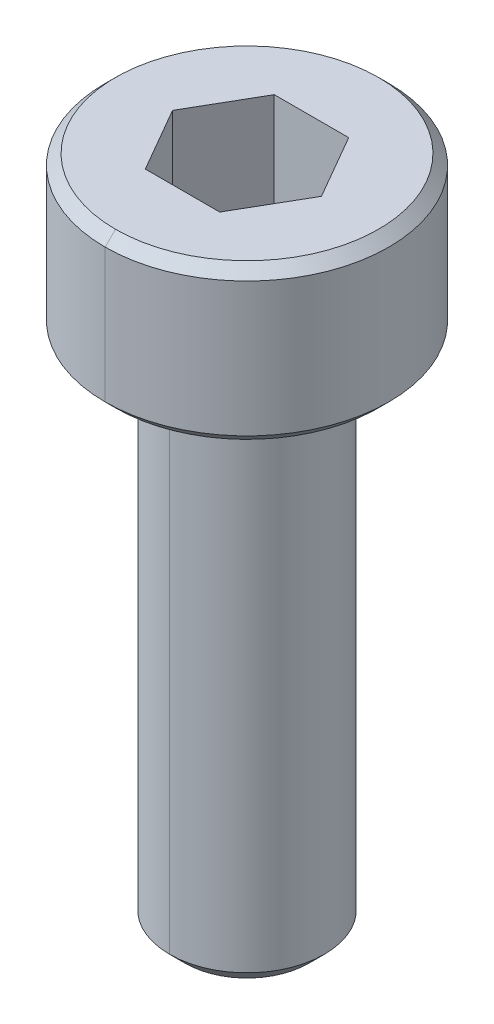
ISO-10303-21;
HEADER;
FILE_DESCRIPTION(('STEP AP214'),'2;1');
FILE_NAME('part.step','',(''),(''),'','','');
FILE_SCHEMA(('AUTOMOTIVE_DESIGN { 1 0 10303 214 1 1 1 1 }'));
ENDSEC;
DATA;
#1=APPLICATION_CONTEXT('core data for automotive mechanical design processes');
#2=APPLICATION_PROTOCOL_DEFINITION('international standard','automotive_design',2000,#1);
#3=PRODUCT_CONTEXT('',#1,'mechanical');
#4=PRODUCT('Part','Part','',(#3));
#5=PRODUCT_RELATED_PRODUCT_CATEGORY('part','',(#4));
#6=PRODUCT_DEFINITION_FORMATION('','',#4);
#7=PRODUCT_DEFINITION_CONTEXT('part definition',#1,'design');
#8=PRODUCT_DEFINITION('design','',#6,#7);
#9=PRODUCT_DEFINITION_SHAPE('','',#8);
#10=(LENGTH_UNIT() NAMED_UNIT(*) SI_UNIT(.MILLI.,.METRE.));
#11=(NAMED_UNIT(*) PLANE_ANGLE_UNIT() SI_UNIT($,.RADIAN.));
#12=(NAMED_UNIT(*) SI_UNIT($,.STERADIAN.) SOLID_ANGLE_UNIT());
#13=UNCERTAINTY_MEASURE_WITH_UNIT(LENGTH_MEASURE(1.E-05),#10,'distance_accuracy_value','');
#14=(GEOMETRIC_REPRESENTATION_CONTEXT(3) GLOBAL_UNCERTAINTY_ASSIGNED_CONTEXT((#13)) GLOBAL_UNIT_ASSIGNED_CONTEXT((#10,
#11,#12)) REPRESENTATION_CONTEXT('',''));
#15=CARTESIAN_POINT('',(0.,0.,0.));
#16=DIRECTION('',(0.,0.,1.));
#17=DIRECTION('',(1.,0.,0.));
#18=AXIS2_PLACEMENT_3D('',#15,#16,#17);
#19=CARTESIAN_POINT('',(0.721687836487033,11.,1.25));
#20=DIRECTION('',(0.866025403784439,0.,0.5));
#21=DIRECTION('',(0.5,0.,-0.866025403784439));
#22=AXIS2_PLACEMENT_3D('',#19,#20,#21);
#23=PLANE('',#22);
#24=DIRECTION('',(0.5,0.,-0.866025403784439));
#25=VECTOR('',#24,1.);
#26=CARTESIAN_POINT('',(0.721687836487033,11.,1.25));
#27=LINE('',#26,#25);
#28=CARTESIAN_POINT('',(0.721687836487033,11.,1.25));
#29=VERTEX_POINT('',#28);
#30=CARTESIAN_POINT('',(1.44337567297406,11.,0.));
#31=VERTEX_POINT('',#30);
#32=EDGE_CURVE('E179',#29,#31,#27,.T.);
#33=ORIENTED_EDGE('',*,*,#32,.F.);
#34=DIRECTION('',(0.,1.,0.));
#35=VECTOR('',#34,1.);
#36=CARTESIAN_POINT('',(0.721687836487033,11.,1.25));
#37=LINE('',#36,#35);
#38=CARTESIAN_POINT('',(0.721687836487033,13.,1.25));
#39=VERTEX_POINT('',#38);
#40=EDGE_CURVE('E167',#29,#39,#37,.T.);
#41=ORIENTED_EDGE('',*,*,#40,.T.);
#42=DIRECTION('',(0.5,0.,-0.866025403784439));
#43=VECTOR('',#42,1.);
#44=CARTESIAN_POINT('',(0.721687836487033,13.,1.25));
#45=LINE('',#44,#43);
#46=CARTESIAN_POINT('',(1.44337567297406,13.,0.));
#47=VERTEX_POINT('',#46);
#48=EDGE_CURVE('E181',#47,#39,#45,.F.);
#49=ORIENTED_EDGE('',*,*,#48,.F.);
#50=DIRECTION('',(0.,1.,0.));
#51=VECTOR('',#50,1.);
#52=CARTESIAN_POINT('',(1.44337567297406,11.,0.));
#53=LINE('',#52,#51);
#54=EDGE_CURVE('E174',#47,#31,#53,.F.);
#55=ORIENTED_EDGE('',*,*,#54,.T.);
#56=EDGE_LOOP('',(#33,#41,#49,#55));
#57=FACE_BOUND('',#56,.T.);
#58=ADVANCED_FACE('F17',(#57),#23,.F.);
#59=CARTESIAN_POINT('',(1.44337567297406,11.,0.));
#60=DIRECTION('',(0.866025403784438,0.,-0.5));
#61=DIRECTION('',(-0.5,0.,-0.866025403784438));
#62=AXIS2_PLACEMENT_3D('',#59,#60,#61);
#63=PLANE('',#62);
#64=DIRECTION('',(-0.5,0.,-0.866025403784438));
#65=VECTOR('',#64,1.);
#66=CARTESIAN_POINT('',(1.44337567297406,11.,0.));
#67=LINE('',#66,#65);
#68=CARTESIAN_POINT('',(0.721687836487031,11.,-1.25));
#69=VERTEX_POINT('',#68);
#70=EDGE_CURVE('E172',#31,#69,#67,.T.);
#71=ORIENTED_EDGE('',*,*,#70,.F.);
#72=ORIENTED_EDGE('',*,*,#54,.F.);
#73=DIRECTION('',(-0.5,0.,-0.866025403784438));
#74=VECTOR('',#73,1.);
#75=CARTESIAN_POINT('',(1.44337567297406,13.,0.));
#76=LINE('',#75,#74);
#77=CARTESIAN_POINT('',(0.721687836487032,13.,-1.25));
#78=VERTEX_POINT('',#77);
#79=EDGE_CURVE('E177',#78,#47,#76,.F.);
#80=ORIENTED_EDGE('',*,*,#79,.F.);
#81=DIRECTION('',(0.,1.,0.));
#82=VECTOR('',#81,1.);
#83=CARTESIAN_POINT('',(0.721687836487031,11.,-1.25));
#84=LINE('',#83,#82);
#85=EDGE_CURVE('E162',#78,#69,#84,.F.);
#86=ORIENTED_EDGE('',*,*,#85,.T.);
#87=EDGE_LOOP('',(#71,#72,#80,#86));
#88=FACE_BOUND('',#87,.T.);
#89=ADVANCED_FACE('F417',(#88),#63,.F.);
#90=CARTESIAN_POINT('',(-0.721687836487032,11.,1.25));
#91=DIRECTION('',(0.,0.,1.));
#92=DIRECTION('',(1.,0.,0.));
#93=AXIS2_PLACEMENT_3D('',#90,#91,#92);
#94=PLANE('',#93);
#95=DIRECTION('',(1.,0.,0.));
#96=VECTOR('',#95,1.);
#97=CARTESIAN_POINT('',(1.44337567297406,11.,1.25));
#98=LINE('',#97,#96);
#99=CARTESIAN_POINT('',(-0.721687836487032,11.,1.25));
#100=VERTEX_POINT('',#99);
#101=EDGE_CURVE('E159',#100,#29,#98,.T.);
#102=ORIENTED_EDGE('',*,*,#101,.F.);
#103=DIRECTION('',(0.,1.,0.));
#104=VECTOR('',#103,1.);
#105=CARTESIAN_POINT('',(-0.721687836487032,11.,1.25));
#106=LINE('',#105,#104);
#107=CARTESIAN_POINT('',(-0.721687836487032,13.,1.25));
#108=VERTEX_POINT('',#107);
#109=EDGE_CURVE('E148',#100,#108,#106,.T.);
#110=ORIENTED_EDGE('',*,*,#109,.T.);
#111=DIRECTION('',(1.,0.,0.));
#112=VECTOR('',#111,1.);
#113=CARTESIAN_POINT('',(-0.721687836487032,13.,1.25));
#114=LINE('',#113,#112);
#115=EDGE_CURVE('E170',#39,#108,#114,.F.);
#116=ORIENTED_EDGE('',*,*,#115,.F.);
#117=ORIENTED_EDGE('',*,*,#40,.F.);
#118=EDGE_LOOP('',(#102,#110,#116,#117));
#119=FACE_BOUND('',#118,.T.);
#120=ADVANCED_FACE('F408',(#119),#94,.F.);
#121=CARTESIAN_POINT('',(0.721687836487031,11.,-1.25));
#122=DIRECTION('',(0.,0.,-1.));
#123=DIRECTION('',(-1.,0.,0.));
#124=AXIS2_PLACEMENT_3D('',#121,#122,#123);
#125=PLANE('',#124);
#126=DIRECTION('',(1.,0.,0.));
#127=VECTOR('',#126,1.);
#128=CARTESIAN_POINT('',(1.44337567297406,11.,-1.25));
#129=LINE('',#128,#127);
#130=CARTESIAN_POINT('',(-0.721687836487032,11.,-1.25));
#131=VERTEX_POINT('',#130);
#132=EDGE_CURVE('E156',#69,#131,#129,.F.);
#133=ORIENTED_EDGE('',*,*,#132,.F.);
#134=ORIENTED_EDGE('',*,*,#85,.F.);
#135=DIRECTION('',(-1.,0.,0.));
#136=VECTOR('',#135,1.);
#137=CARTESIAN_POINT('',(0.721687836487031,13.,-1.25));
#138=LINE('',#137,#136);
#139=CARTESIAN_POINT('',(-0.721687836487032,13.,-1.25));
#140=VERTEX_POINT('',#139);
#141=EDGE_CURVE('E165',#140,#78,#138,.F.);
#142=ORIENTED_EDGE('',*,*,#141,.F.);
#143=DIRECTION('',(0.,1.,0.));
#144=VECTOR('',#143,1.);
#145=CARTESIAN_POINT('',(-0.721687836487032,11.,-1.25));
#146=LINE('',#145,#144);
#147=EDGE_CURVE('E146',#140,#131,#146,.F.);
#148=ORIENTED_EDGE('',*,*,#147,.T.);
#149=EDGE_LOOP('',(#133,#134,#142,#148));
#150=FACE_BOUND('',#149,.T.);
#151=ADVANCED_FACE('F399',(#150),#125,.F.);
#152=CARTESIAN_POINT('',(1.44337567297406,11.,0.));
#153=DIRECTION('',(0.,1.,0.));
#154=DIRECTION('',(0.,0.,1.));
#155=AXIS2_PLACEMENT_3D('',#152,#153,#154);
#156=PLANE('',#155);
#157=ORIENTED_EDGE('',*,*,#132,.T.);
#158=DIRECTION('',(-0.5,0.,0.866025403784439));
#159=VECTOR('',#158,1.);
#160=CARTESIAN_POINT('',(-0.721687836487032,11.,-1.25));
#161=LINE('',#160,#159);
#162=CARTESIAN_POINT('',(-1.44337567297406,11.,0.));
#163=VERTEX_POINT('',#162);
#164=EDGE_CURVE('E144',#131,#163,#161,.T.);
#165=ORIENTED_EDGE('',*,*,#164,.T.);
#166=DIRECTION('',(0.5,0.,0.866025403784438));
#167=VECTOR('',#166,1.);
#168=CARTESIAN_POINT('',(-1.44337567297406,11.,0.));
#169=LINE('',#168,#167);
#170=EDGE_CURVE('E151',#163,#100,#169,.T.);
#171=ORIENTED_EDGE('',*,*,#170,.T.);
#172=ORIENTED_EDGE('',*,*,#101,.T.);
#173=ORIENTED_EDGE('',*,*,#32,.T.);
#174=ORIENTED_EDGE('',*,*,#70,.T.);
#175=EDGE_LOOP('',(#157,#165,#171,#172,#173,#174));
#176=FACE_BOUND('',#175,.T.);
#177=ADVANCED_FACE('F390',(#176),#156,.T.);
#178=CARTESIAN_POINT('',(-1.44337567297406,11.,0.));
#179=DIRECTION('',(-0.866025403784438,0.,0.5));
#180=DIRECTION('',(0.5,0.,0.866025403784438));
#181=AXIS2_PLACEMENT_3D('',#178,#179,#180);
#182=PLANE('',#181);
#183=ORIENTED_EDGE('',*,*,#170,.F.);
#184=DIRECTION('',(0.,1.,0.));
#185=VECTOR('',#184,1.);
#186=CARTESIAN_POINT('',(-1.44337567297407,11.,0.));
#187=LINE('',#186,#185);
#188=CARTESIAN_POINT('',(-1.44337567297406,13.,0.));
#189=VERTEX_POINT('',#188);
#190=EDGE_CURVE('E141',#163,#189,#187,.T.);
#191=ORIENTED_EDGE('',*,*,#190,.T.);
#192=DIRECTION('',(0.5,0.,0.866025403784438));
#193=VECTOR('',#192,1.);
#194=CARTESIAN_POINT('',(-1.44337567297406,13.,0.));
#195=LINE('',#194,#193);
#196=EDGE_CURVE('E154',#108,#189,#195,.F.);
#197=ORIENTED_EDGE('',*,*,#196,.F.);
#198=ORIENTED_EDGE('',*,*,#109,.F.);
#199=EDGE_LOOP('',(#183,#191,#197,#198));
#200=FACE_BOUND('',#199,.T.);
#201=ADVANCED_FACE('F381',(#200),#182,.F.);
#202=CARTESIAN_POINT('',(-0.721687836487032,11.,-1.25));
#203=DIRECTION('',(-0.866025403784439,0.,-0.5));
#204=DIRECTION('',(-0.5,0.,0.866025403784439));
#205=AXIS2_PLACEMENT_3D('',#202,#203,#204);
#206=PLANE('',#205);
#207=ORIENTED_EDGE('',*,*,#164,.F.);
#208=ORIENTED_EDGE('',*,*,#147,.F.);
#209=DIRECTION('',(0.5,0.,-0.866025403784438));
#210=VECTOR('',#209,1.);
#211=CARTESIAN_POINT('',(-1.44337567297406,13.,0.));
#212=LINE('',#211,#210);
#213=EDGE_CURVE('E122',#189,#140,#212,.T.);
#214=ORIENTED_EDGE('',*,*,#213,.F.);
#215=ORIENTED_EDGE('',*,*,#190,.F.);
#216=EDGE_LOOP('',(#207,#208,#214,#215));
#217=FACE_BOUND('',#216,.T.);
#218=ADVANCED_FACE('F373',(#217),#206,.F.);
#219=CARTESIAN_POINT('',(0.,13.,-2.75));
#220=DIRECTION('',(0.,1.,0.));
#221=DIRECTION('',(0.,0.,1.));
#222=AXIS2_PLACEMENT_3D('',#219,#220,#221);
#223=PLANE('',#222);
#224=CARTESIAN_POINT('',(0.,13.0000000000337,0.));
#225=DIRECTION('',(0.,-1.,0.));
#226=DIRECTION('',(0.,0.,-1.));
#227=AXIS2_PLACEMENT_3D('',#224,#225,#226);
#228=CIRCLE('',#227,2.54999999992833);
#229=CARTESIAN_POINT('',(0.,13.0000000000337,-2.54999999992833));
#230=VERTEX_POINT('',#229);
#231=CARTESIAN_POINT('',(0.,13.0000000000337,2.54999999992833));
#232=VERTEX_POINT('',#231);
#233=EDGE_CURVE('E111',#230,#232,#228,.T.);
#234=ORIENTED_EDGE('',*,*,#233,.F.);
#235=CARTESIAN_POINT('',(0.,13.0000000000337,0.));
#236=DIRECTION('',(0.,-1.,0.));
#237=DIRECTION('',(0.,0.,-1.));
#238=AXIS2_PLACEMENT_3D('',#235,#236,#237);
#239=CIRCLE('',#238,2.54999999992833);
#240=EDGE_CURVE('E20',#232,#230,#239,.T.);
#241=ORIENTED_EDGE('',*,*,#240,.F.);
#242=EDGE_LOOP('',(#234,#241));
#243=FACE_BOUND('',#242,.T.);
#244=ORIENTED_EDGE('',*,*,#196,.T.);
#245=ORIENTED_EDGE('',*,*,#213,.T.);
#246=ORIENTED_EDGE('',*,*,#141,.T.);
#247=ORIENTED_EDGE('',*,*,#79,.T.);
#248=ORIENTED_EDGE('',*,*,#48,.T.);
#249=ORIENTED_EDGE('',*,*,#115,.T.);
#250=EDGE_LOOP('',(#244,#245,#246,#247,#248,#249));
#251=FACE_BOUND('',#250,.T.);
#252=ADVANCED_FACE('F112',(#243,#251),#223,.T.);
#253=CARTESIAN_POINT('',(0.,12.8000000000839,0.));
#254=DIRECTION('',(0.,-1.,0.));
#255=DIRECTION('',(0.,0.,-1.));
#256=AXIS2_PLACEMENT_3D('',#253,#254,#255);
#257=CONICAL_SURFACE('',#256,2.74999999987813,0.785398163397448);
#258=DIRECTION('',(0.,0.707106781186548,0.707106781186548));
#259=VECTOR('',#258,1.);
#260=CARTESIAN_POINT('',(0.,-498984.45,-499000.));
#261=LINE('',#260,#259);
#262=CARTESIAN_POINT('',(0.,12.800000000021,-2.74999999996953));
#263=VERTEX_POINT('',#262);
#264=EDGE_CURVE('E120',#263,#230,#261,.T.);
#265=ORIENTED_EDGE('',*,*,#264,.F.);
#266=CARTESIAN_POINT('',(0.,12.8,0.));
#267=DIRECTION('',(0.,-1.,0.));
#268=DIRECTION('',(0.,0.,-1.));
#269=AXIS2_PLACEMENT_3D('',#266,#267,#268);
#270=CIRCLE('',#269,2.75);
#271=CARTESIAN_POINT('',(0.,12.800000000021,2.74999999996953));
#272=VERTEX_POINT('',#271);
#273=EDGE_CURVE('E127',#272,#263,#270,.T.);
#274=ORIENTED_EDGE('',*,*,#273,.F.);
#275=DIRECTION('',(0.,0.707106781186548,-0.707106781186548));
#276=VECTOR('',#275,1.);
#277=CARTESIAN_POINT('',(6.11098752774529E-11,-498984.45,499000.));
#278=LINE('',#277,#276);
#279=EDGE_CURVE('E117',#232,#272,#278,.F.);
#280=ORIENTED_EDGE('',*,*,#279,.F.);
#281=ORIENTED_EDGE('',*,*,#240,.T.);
#282=EDGE_LOOP('',(#265,#274,#280,#281));
#283=FACE_BOUND('',#282,.T.);
#284=ADVANCED_FACE('F119',(#283),#257,.T.);
#285=CARTESIAN_POINT('',(0.,12.8000000000839,0.));
#286=DIRECTION('',(0.,-1.,0.));
#287=DIRECTION('',(0.,0.,-1.));
#288=AXIS2_PLACEMENT_3D('',#285,#286,#287);
#289=CONICAL_SURFACE('',#288,2.74999999987813,0.785398163397448);
#290=CARTESIAN_POINT('',(0.,12.8,0.));
#291=DIRECTION('',(0.,-1.,0.));
#292=DIRECTION('',(0.,0.,-1.));
#293=AXIS2_PLACEMENT_3D('',#290,#291,#292);
#294=CIRCLE('',#293,2.75);
#295=EDGE_CURVE('E125',#263,#272,#294,.T.);
#296=ORIENTED_EDGE('',*,*,#295,.F.);
#297=ORIENTED_EDGE('',*,*,#264,.T.);
#298=ORIENTED_EDGE('',*,*,#233,.T.);
#299=ORIENTED_EDGE('',*,*,#279,.T.);
#300=EDGE_LOOP('',(#296,#297,#298,#299));
#301=FACE_BOUND('',#300,.T.);
#302=ADVANCED_FACE('F123',(#301),#289,.T.);
#303=CARTESIAN_POINT('',(0.,0.,0.));
#304=DIRECTION('',(0.,-1.,0.));
#305=DIRECTION('',(0.,0.,-1.));
#306=AXIS2_PLACEMENT_3D('',#303,#304,#305);
#307=CYLINDRICAL_SURFACE('',#306,2.75);
#308=DIRECTION('',(0.,-1.,0.));
#309=VECTOR('',#308,1.);
#310=CARTESIAN_POINT('',(0.,0.,-2.75));
#311=LINE('',#310,#309);
#312=CARTESIAN_POINT('',(0.,10.1999999999194,-2.74999999993702));
#313=VERTEX_POINT('',#312);
#314=EDGE_CURVE('E226',#313,#263,#311,.F.);
#315=ORIENTED_EDGE('',*,*,#314,.F.);
#316=CARTESIAN_POINT('',(0.,10.1999999999407,0.));
#317=DIRECTION('',(0.,1.,0.));
#318=DIRECTION('',(0.,0.,1.));
#319=AXIS2_PLACEMENT_3D('',#316,#317,#318);
#320=CIRCLE('',#319,2.74999999993497);
#321=CARTESIAN_POINT('',(0.,10.1999999999407,2.74999999993702));
#322=VERTEX_POINT('',#321);
#323=EDGE_CURVE('E221',#322,#313,#320,.F.);
#324=ORIENTED_EDGE('',*,*,#323,.F.);
#325=DIRECTION('',(0.,-1.,0.));
#326=VECTOR('',#325,1.);
#327=CARTESIAN_POINT('',(0.,0.,2.75));
#328=LINE('',#327,#326);
#329=EDGE_CURVE('E231',#272,#322,#328,.T.);
#330=ORIENTED_EDGE('',*,*,#329,.F.);
#331=ORIENTED_EDGE('',*,*,#273,.T.);
#332=EDGE_LOOP('',(#315,#324,#330,#331));
#333=FACE_BOUND('',#332,.T.);
#334=ADVANCED_FACE('F246',(#333),#307,.T.);
#335=CARTESIAN_POINT('',(0.,0.,0.));
#336=DIRECTION('',(0.,-1.,0.));
#337=DIRECTION('',(0.,0.,-1.));
#338=AXIS2_PLACEMENT_3D('',#335,#336,#337);
#339=CYLINDRICAL_SURFACE('',#338,2.75);
#340=CARTESIAN_POINT('',(0.,10.1999999999407,0.));
#341=DIRECTION('',(0.,1.,0.));
#342=DIRECTION('',(0.,0.,1.));
#343=AXIS2_PLACEMENT_3D('',#340,#341,#342);
#344=CIRCLE('',#343,2.74999999993497);
#345=EDGE_CURVE('E206',#313,#322,#344,.F.);
#346=ORIENTED_EDGE('',*,*,#345,.F.);
#347=ORIENTED_EDGE('',*,*,#314,.T.);
#348=ORIENTED_EDGE('',*,*,#295,.T.);
#349=ORIENTED_EDGE('',*,*,#329,.T.);
#350=EDGE_LOOP('',(#346,#347,#348,#349));
#351=FACE_BOUND('',#350,.T.);
#352=ADVANCED_FACE('F243',(#351),#339,.T.);
#353=CARTESIAN_POINT('',(0.,10.199999999827,0.));
#354=DIRECTION('',(0.,1.,0.));
#355=DIRECTION('',(0.,0.,1.));
#356=AXIS2_PLACEMENT_3D('',#353,#354,#355);
#357=CONICAL_SURFACE('',#356,2.74999999982128,0.785398163397448);
#358=DIRECTION('',(0.,-0.707106781186548,-0.707106781186548));
#359=VECTOR('',#358,1.);
#360=CARTESIAN_POINT('',(0.,499000.,498992.55));
#361=LINE('',#360,#359);
#362=CARTESIAN_POINT('',(0.,9.99999999993406,2.54999999992833));
#363=VERTEX_POINT('',#362);
#364=EDGE_CURVE('E203',#322,#363,#361,.T.);
#365=ORIENTED_EDGE('',*,*,#364,.F.);
#366=ORIENTED_EDGE('',*,*,#323,.T.);
#367=DIRECTION('',(0.,-0.707106781186548,0.707106781186548));
#368=VECTOR('',#367,1.);
#369=CARTESIAN_POINT('',(6.11089629155876E-11,499000.,-498992.55));
#370=LINE('',#369,#368);
#371=CARTESIAN_POINT('',(0.,9.99999999993406,-2.54999999992833));
#372=VERTEX_POINT('',#371);
#373=EDGE_CURVE('E212',#372,#313,#370,.F.);
#374=ORIENTED_EDGE('',*,*,#373,.F.);
#375=CARTESIAN_POINT('',(0.,9.99999999993406,0.));
#376=DIRECTION('',(0.,1.,0.));
#377=DIRECTION('',(0.,0.,1.));
#378=AXIS2_PLACEMENT_3D('',#375,#376,#377);
#379=CIRCLE('',#378,2.54999999992833);
#380=EDGE_CURVE('E198',#363,#372,#379,.F.);
#381=ORIENTED_EDGE('',*,*,#380,.F.);
#382=EDGE_LOOP('',(#365,#366,#374,#381));
#383=FACE_BOUND('',#382,.T.);
#384=ADVANCED_FACE('F248',(#383),#357,.T.);
#385=CARTESIAN_POINT('',(0.,10.199999999827,0.));
#386=DIRECTION('',(0.,1.,0.));
#387=DIRECTION('',(0.,0.,1.));
#388=AXIS2_PLACEMENT_3D('',#385,#386,#387);
#389=CONICAL_SURFACE('',#388,2.74999999982128,0.785398163397448);
#390=ORIENTED_EDGE('',*,*,#345,.T.);
#391=ORIENTED_EDGE('',*,*,#364,.T.);
#392=CARTESIAN_POINT('',(0.,9.99999999993406,0.));
#393=DIRECTION('',(0.,1.,0.));
#394=DIRECTION('',(0.,0.,1.));
#395=AXIS2_PLACEMENT_3D('',#392,#393,#394);
#396=CIRCLE('',#395,2.54999999992833);
#397=EDGE_CURVE('E195',#372,#363,#396,.F.);
#398=ORIENTED_EDGE('',*,*,#397,.F.);
#399=ORIENTED_EDGE('',*,*,#373,.T.);
#400=EDGE_LOOP('',(#390,#391,#398,#399));
#401=FACE_BOUND('',#400,.T.);
#402=ADVANCED_FACE('F249',(#401),#389,.T.);
#403=CARTESIAN_POINT('',(0.,0.,0.));
#404=DIRECTION('',(0.,-1.,0.));
#405=DIRECTION('',(0.,0.,-1.));
#406=AXIS2_PLACEMENT_3D('',#403,#404,#405);
#407=PLANE('',#406);
#408=CARTESIAN_POINT('',(0.,5.6843418860808E-11,0.));
#409=DIRECTION('',(0.,1.,0.));
#410=DIRECTION('',(0.,0.,1.));
#411=AXIS2_PLACEMENT_3D('',#408,#409,#410);
#412=CIRCLE('',#411,1.20000000003984);
#413=CARTESIAN_POINT('',(0.,5.6843418860808E-11,1.20000000003984));
#414=VERTEX_POINT('',#413);
#415=CARTESIAN_POINT('',(0.,5.6843418860808E-11,-1.20000000003984));
#416=VERTEX_POINT('',#415);
#417=EDGE_CURVE('E191',#414,#416,#412,.T.);
#418=ORIENTED_EDGE('',*,*,#417,.F.);
#419=CARTESIAN_POINT('',(0.,5.6843418860808E-11,0.));
#420=DIRECTION('',(0.,1.,0.));
#421=DIRECTION('',(0.,0.,1.));
#422=AXIS2_PLACEMENT_3D('',#419,#420,#421);
#423=CIRCLE('',#422,1.20000000003984);
#424=EDGE_CURVE('E201',#416,#414,#423,.T.);
#425=ORIENTED_EDGE('',*,*,#424,.F.);
#426=EDGE_LOOP('',(#418,#425));
#427=FACE_BOUND('',#426,.T.);
#428=ADVANCED_FACE('F271',(#427),#407,.T.);
#429=CARTESIAN_POINT('',(0.,0.300000000038381,0.));
#430=DIRECTION('',(0.,1.,0.));
#431=DIRECTION('',(0.,0.,1.));
#432=AXIS2_PLACEMENT_3D('',#429,#430,#431);
#433=CONICAL_SURFACE('',#432,1.50000000002137,0.785398163397448);
#434=DIRECTION('',(0.,-0.707106781186548,-0.707106781186547));
#435=VECTOR('',#434,1.);
#436=CARTESIAN_POINT('',(0.,498998.8,499000.));
#437=LINE('',#436,#435);
#438=CARTESIAN_POINT('',(0.,0.300000000023989,1.50000000001336));
#439=VERTEX_POINT('',#438);
#440=EDGE_CURVE('E190',#439,#414,#437,.T.);
#441=ORIENTED_EDGE('',*,*,#440,.F.);
#442=CARTESIAN_POINT('',(0.,0.300000000000003,0.));
#443=DIRECTION('',(0.,-1.,0.));
#444=DIRECTION('',(0.,0.,-1.));
#445=AXIS2_PLACEMENT_3D('',#442,#443,#444);
#446=CIRCLE('',#445,1.5);
#447=CARTESIAN_POINT('',(0.,0.300000000028786,-1.50000000001603));
#448=VERTEX_POINT('',#447);
#449=EDGE_CURVE('E35',#448,#439,#446,.F.);
#450=ORIENTED_EDGE('',*,*,#449,.F.);
#451=DIRECTION('',(0.,-0.707106781186548,0.707106781186547));
#452=VECTOR('',#451,1.);
#453=CARTESIAN_POINT('',(6.11098752774529E-11,498998.8,-499000.));
#454=LINE('',#453,#452);
#455=EDGE_CURVE('E194',#416,#448,#454,.F.);
#456=ORIENTED_EDGE('',*,*,#455,.F.);
#457=ORIENTED_EDGE('',*,*,#424,.T.);
#458=EDGE_LOOP('',(#441,#450,#456,#457));
#459=FACE_BOUND('',#458,.T.);
#460=ADVANCED_FACE('F255',(#459),#433,.T.);
#461=CARTESIAN_POINT('',(0.,10.,-1.5));
#462=DIRECTION('',(0.,-1.,0.));
#463=DIRECTION('',(0.,0.,-1.));
#464=AXIS2_PLACEMENT_3D('',#461,#462,#463);
#465=PLANE('',#464);
#466=ORIENTED_EDGE('',*,*,#380,.T.);
#467=ORIENTED_EDGE('',*,*,#397,.T.);
#468=EDGE_LOOP('',(#466,#467));
#469=FACE_BOUND('',#468,.T.);
#470=CARTESIAN_POINT('',(0.,10.,0.));
#471=DIRECTION('',(0.,-1.,0.));
#472=DIRECTION('',(0.,0.,-1.));
#473=AXIS2_PLACEMENT_3D('',#470,#471,#472);
#474=CIRCLE('',#473,1.5);
#475=CARTESIAN_POINT('',(0.,10.,-1.5));
#476=VERTEX_POINT('',#475);
#477=CARTESIAN_POINT('',(0.,10.,1.5));
#478=VERTEX_POINT('',#477);
#479=EDGE_CURVE('E183',#476,#478,#474,.T.);
#480=ORIENTED_EDGE('',*,*,#479,.F.);
#481=CARTESIAN_POINT('',(0.,10.,0.));
#482=DIRECTION('',(0.,-1.,0.));
#483=DIRECTION('',(0.,0.,-1.));
#484=AXIS2_PLACEMENT_3D('',#481,#482,#483);
#485=CIRCLE('',#484,1.5);
#486=EDGE_CURVE('E187',#478,#476,#485,.T.);
#487=ORIENTED_EDGE('',*,*,#486,.F.);
#488=EDGE_LOOP('',(#480,#487));
#489=FACE_BOUND('',#488,.T.);
#490=ADVANCED_FACE('F251',(#469,#489),#465,.T.);
#491=CARTESIAN_POINT('',(0.,0.300000000038381,0.));
#492=DIRECTION('',(0.,1.,0.));
#493=DIRECTION('',(0.,0.,1.));
#494=AXIS2_PLACEMENT_3D('',#491,#492,#493);
#495=CONICAL_SURFACE('',#494,1.50000000002137,0.785398163397448);
#496=CARTESIAN_POINT('',(0.,0.300000000000003,0.));
#497=DIRECTION('',(0.,-1.,0.));
#498=DIRECTION('',(0.,0.,-1.));
#499=AXIS2_PLACEMENT_3D('',#496,#497,#498);
#500=CIRCLE('',#499,1.5);
#501=EDGE_CURVE('E26',#439,#448,#500,.F.);
#502=ORIENTED_EDGE('',*,*,#501,.F.);
#503=ORIENTED_EDGE('',*,*,#440,.T.);
#504=ORIENTED_EDGE('',*,*,#417,.T.);
#505=ORIENTED_EDGE('',*,*,#455,.T.);
#506=EDGE_LOOP('',(#502,#503,#504,#505));
#507=FACE_BOUND('',#506,.T.);
#508=ADVANCED_FACE('F254',(#507),#495,.T.);
#509=CARTESIAN_POINT('',(0.,0.,0.));
#510=DIRECTION('',(0.,-1.,0.));
#511=DIRECTION('',(0.,0.,-1.));
#512=AXIS2_PLACEMENT_3D('',#509,#510,#511);
#513=CYLINDRICAL_SURFACE('',#512,1.5);
#514=DIRECTION('',(0.,-1.,0.));
#515=VECTOR('',#514,1.);
#516=CARTESIAN_POINT('',(0.,0.,-1.5));
#517=LINE('',#516,#515);
#518=EDGE_CURVE('E11',#448,#476,#517,.F.);
#519=ORIENTED_EDGE('',*,*,#518,.F.);
#520=ORIENTED_EDGE('',*,*,#449,.T.);
#521=DIRECTION('',(0.,-1.,0.));
#522=VECTOR('',#521,1.);
#523=CARTESIAN_POINT('',(0.,0.,1.5));
#524=LINE('',#523,#522);
#525=EDGE_CURVE('E186',#478,#439,#524,.T.);
#526=ORIENTED_EDGE('',*,*,#525,.F.);
#527=ORIENTED_EDGE('',*,*,#486,.T.);
#528=EDGE_LOOP('',(#519,#520,#526,#527));
#529=FACE_BOUND('',#528,.T.);
#530=ADVANCED_FACE('F262',(#529),#513,.T.);
#531=CARTESIAN_POINT('',(0.,0.,0.));
#532=DIRECTION('',(0.,-1.,0.));
#533=DIRECTION('',(0.,0.,-1.));
#534=AXIS2_PLACEMENT_3D('',#531,#532,#533);
#535=CYLINDRICAL_SURFACE('',#534,1.5);
#536=ORIENTED_EDGE('',*,*,#501,.T.);
#537=ORIENTED_EDGE('',*,*,#518,.T.);
#538=ORIENTED_EDGE('',*,*,#479,.T.);
#539=ORIENTED_EDGE('',*,*,#525,.T.);
#540=EDGE_LOOP('',(#536,#537,#538,#539));
#541=FACE_BOUND('',#540,.T.);
#542=ADVANCED_FACE('F264',(#541),#535,.T.);
#543=CLOSED_SHELL('',(#58,#89,#120,#151,#177,#201,#218,#252,#284,#302,#334,#352,#384,#402,#428,
#460,#490,#508,#530,#542));
#544=MANIFOLD_SOLID_BREP('B1',#543);
#545=ADVANCED_BREP_SHAPE_REPRESENTATION('',(#18,#544),#14);
#546=SHAPE_DEFINITION_REPRESENTATION(#9,#545);
ENDSEC;
END-ISO-10303-21;
